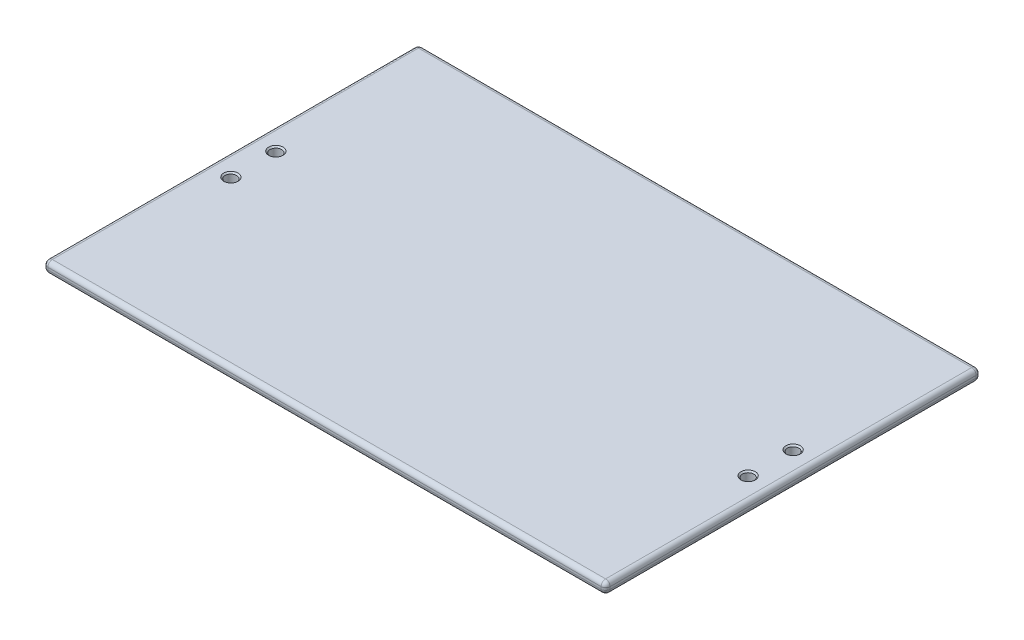
ISO-10303-21;
HEADER;
FILE_DESCRIPTION(('STEP AP214'),'2;1');
FILE_NAME('part.step','',(''),(''),'','','');
FILE_SCHEMA(('AUTOMOTIVE_DESIGN { 1 0 10303 214 1 1 1 1 }'));
ENDSEC;
DATA;
#1=APPLICATION_CONTEXT('core data for automotive mechanical design processes');
#2=APPLICATION_PROTOCOL_DEFINITION('international standard','automotive_design',2000,#1);
#3=PRODUCT_CONTEXT('',#1,'mechanical');
#4=PRODUCT('Part','Part','',(#3));
#5=PRODUCT_RELATED_PRODUCT_CATEGORY('part','',(#4));
#6=PRODUCT_DEFINITION_FORMATION('','',#4);
#7=PRODUCT_DEFINITION_CONTEXT('part definition',#1,'design');
#8=PRODUCT_DEFINITION('design','',#6,#7);
#9=PRODUCT_DEFINITION_SHAPE('','',#8);
#10=(LENGTH_UNIT() NAMED_UNIT(*) SI_UNIT(.MILLI.,.METRE.));
#11=(NAMED_UNIT(*) PLANE_ANGLE_UNIT() SI_UNIT($,.RADIAN.));
#12=(NAMED_UNIT(*) SI_UNIT($,.STERADIAN.) SOLID_ANGLE_UNIT());
#13=UNCERTAINTY_MEASURE_WITH_UNIT(LENGTH_MEASURE(1.E-05),#10,'distance_accuracy_value','');
#14=(GEOMETRIC_REPRESENTATION_CONTEXT(3) GLOBAL_UNCERTAINTY_ASSIGNED_CONTEXT((#13)) GLOBAL_UNIT_ASSIGNED_CONTEXT((#10,
#11,#12)) REPRESENTATION_CONTEXT('',''));
#15=CARTESIAN_POINT('',(0.,0.,0.));
#16=DIRECTION('',(0.,0.,1.));
#17=DIRECTION('',(1.,0.,0.));
#18=AXIS2_PLACEMENT_3D('',#15,#16,#17);
#19=CARTESIAN_POINT('',(-20.,2.,-33.35));
#20=DIRECTION('',(0.,0.,1.));
#21=DIRECTION('',(1.,0.,0.));
#22=AXIS2_PLACEMENT_3D('',#19,#20,#21);
#23=PLANE('',#22);
#24=DIRECTION('',(1.,0.,0.));
#25=VECTOR('',#24,1.);
#26=CARTESIAN_POINT('',(-20.,16.2,-33.35));
#27=LINE('',#26,#25);
#28=CARTESIAN_POINT('',(-119.2,16.2,-33.35));
#29=VERTEX_POINT('',#28);
#30=CARTESIAN_POINT('',(-20.8,16.2,-33.35));
#31=VERTEX_POINT('',#30);
#32=EDGE_CURVE('E243',#29,#31,#27,.T.);
#33=ORIENTED_EDGE('',*,*,#32,.T.);
#34=DIRECTION('',(0.,1.,0.));
#35=VECTOR('',#34,1.);
#36=CARTESIAN_POINT('',(-20.8,2.,-33.35));
#37=LINE('',#36,#35);
#38=CARTESIAN_POINT('',(-20.8,15.8,-33.35));
#39=VERTEX_POINT('',#38);
#40=EDGE_CURVE('E245',#31,#39,#37,.F.);
#41=ORIENTED_EDGE('',*,*,#40,.T.);
#42=DIRECTION('',(1.,0.,0.));
#43=VECTOR('',#42,1.);
#44=CARTESIAN_POINT('',(-20.,15.8,-33.35));
#45=LINE('',#44,#43);
#46=CARTESIAN_POINT('',(-119.2,15.8,-33.35));
#47=VERTEX_POINT('',#46);
#48=EDGE_CURVE('E241',#39,#47,#45,.F.);
#49=ORIENTED_EDGE('',*,*,#48,.T.);
#50=DIRECTION('',(0.,1.,0.));
#51=VECTOR('',#50,1.);
#52=CARTESIAN_POINT('',(-119.2,2.,-33.35));
#53=LINE('',#52,#51);
#54=EDGE_CURVE('E239',#47,#29,#53,.T.);
#55=ORIENTED_EDGE('',*,*,#54,.T.);
#56=EDGE_LOOP('',(#33,#41,#49,#55));
#57=FACE_BOUND('',#56,.T.);
#58=ADVANCED_FACE('F79',(#57),#23,.F.);
#59=CARTESIAN_POINT('',(-20.,2.,33.35));
#60=DIRECTION('',(0.,0.,-1.));
#61=DIRECTION('',(-1.,0.,0.));
#62=AXIS2_PLACEMENT_3D('',#59,#60,#61);
#63=PLANE('',#62);
#64=DIRECTION('',(1.,0.,0.));
#65=VECTOR('',#64,1.);
#66=CARTESIAN_POINT('',(-20.,15.8,33.35));
#67=LINE('',#66,#65);
#68=CARTESIAN_POINT('',(-119.2,15.8,33.35));
#69=VERTEX_POINT('',#68);
#70=CARTESIAN_POINT('',(-20.8,15.8,33.35));
#71=VERTEX_POINT('',#70);
#72=EDGE_CURVE('E179',#69,#71,#67,.T.);
#73=ORIENTED_EDGE('',*,*,#72,.T.);
#74=DIRECTION('',(0.,1.,0.));
#75=VECTOR('',#74,1.);
#76=CARTESIAN_POINT('',(-20.8,2.,33.35));
#77=LINE('',#76,#75);
#78=CARTESIAN_POINT('',(-20.8,16.2,33.35));
#79=VERTEX_POINT('',#78);
#80=EDGE_CURVE('E175',#71,#79,#77,.T.);
#81=ORIENTED_EDGE('',*,*,#80,.T.);
#82=DIRECTION('',(1.,0.,0.));
#83=VECTOR('',#82,1.);
#84=CARTESIAN_POINT('',(-120.,16.2,33.35));
#85=LINE('',#84,#83);
#86=CARTESIAN_POINT('',(-119.2,16.2,33.35));
#87=VERTEX_POINT('',#86);
#88=EDGE_CURVE('E167',#79,#87,#85,.F.);
#89=ORIENTED_EDGE('',*,*,#88,.T.);
#90=DIRECTION('',(0.,1.,0.));
#91=VECTOR('',#90,1.);
#92=CARTESIAN_POINT('',(-119.2,2.,33.35));
#93=LINE('',#92,#91);
#94=EDGE_CURVE('E172',#87,#69,#93,.F.);
#95=ORIENTED_EDGE('',*,*,#94,.T.);
#96=EDGE_LOOP('',(#73,#81,#89,#95));
#97=FACE_BOUND('',#96,.T.);
#98=ADVANCED_FACE('F170',(#97),#63,.F.);
#99=CARTESIAN_POINT('',(-120.,15.,-33.35));
#100=DIRECTION('',(0.,1.,0.));
#101=DIRECTION('',(0.,0.,1.));
#102=AXIS2_PLACEMENT_3D('',#99,#100,#101);
#103=PLANE('',#102);
#104=DIRECTION('',(0.,0.,1.));
#105=VECTOR('',#104,1.);
#106=CARTESIAN_POINT('',(-20.8,15.,-33.35));
#107=LINE('',#106,#105);
#108=CARTESIAN_POINT('',(-20.8,15.,-32.55));
#109=VERTEX_POINT('',#108);
#110=CARTESIAN_POINT('',(-20.8,15.,32.55));
#111=VERTEX_POINT('',#110);
#112=EDGE_CURVE('E218',#109,#111,#107,.T.);
#113=ORIENTED_EDGE('',*,*,#112,.T.);
#114=DIRECTION('',(1.,0.,0.));
#115=VECTOR('',#114,1.);
#116=CARTESIAN_POINT('',(-120.,15.,32.55));
#117=LINE('',#116,#115);
#118=CARTESIAN_POINT('',(-119.2,15.,32.55));
#119=VERTEX_POINT('',#118);
#120=EDGE_CURVE('E220',#111,#119,#117,.F.);
#121=ORIENTED_EDGE('',*,*,#120,.T.);
#122=DIRECTION('',(0.,0.,1.));
#123=VECTOR('',#122,1.);
#124=CARTESIAN_POINT('',(-119.2,15.,-33.35));
#125=LINE('',#124,#123);
#126=CARTESIAN_POINT('',(-119.2,15.,-32.55));
#127=VERTEX_POINT('',#126);
#128=EDGE_CURVE('E214',#119,#127,#125,.F.);
#129=ORIENTED_EDGE('',*,*,#128,.T.);
#130=DIRECTION('',(1.,0.,0.));
#131=VECTOR('',#130,1.);
#132=CARTESIAN_POINT('',(-120.,15.,-32.55));
#133=LINE('',#132,#131);
#134=EDGE_CURVE('E216',#127,#109,#133,.T.);
#135=ORIENTED_EDGE('',*,*,#134,.T.);
#136=EDGE_LOOP('',(#113,#121,#129,#135));
#137=FACE_BOUND('',#136,.T.);
#138=CARTESIAN_POINT('',(-116.,15.,-3.99999999999999));
#139=DIRECTION('',(0.,1.,0.));
#140=DIRECTION('',(0.,0.,1.));
#141=AXIS2_PLACEMENT_3D('',#138,#139,#140);
#142=CIRCLE('',#141,1.025);
#143=CARTESIAN_POINT('',(-116.,15.,-2.97499999999999));
#144=VERTEX_POINT('',#143);
#145=EDGE_CURVE('E315',#144,#144,#142,.T.);
#146=ORIENTED_EDGE('',*,*,#145,.T.);
#147=EDGE_LOOP('',(#146));
#148=FACE_BOUND('',#147,.T.);
#149=CARTESIAN_POINT('',(-116.,15.,4.00000000000001));
#150=DIRECTION('',(0.,1.,0.));
#151=DIRECTION('',(0.,0.,1.));
#152=AXIS2_PLACEMENT_3D('',#149,#150,#151);
#153=CIRCLE('',#152,1.025);
#154=CARTESIAN_POINT('',(-116.,15.,5.02500000000001));
#155=VERTEX_POINT('',#154);
#156=EDGE_CURVE('E326',#155,#155,#153,.T.);
#157=ORIENTED_EDGE('',*,*,#156,.T.);
#158=EDGE_LOOP('',(#157));
#159=FACE_BOUND('',#158,.T.);
#160=CARTESIAN_POINT('',(-24.,15.,-3.99999999999999));
#161=DIRECTION('',(0.,1.,0.));
#162=DIRECTION('',(0.,0.,1.));
#163=AXIS2_PLACEMENT_3D('',#160,#161,#162);
#164=CIRCLE('',#163,1.025);
#165=CARTESIAN_POINT('',(-24.,15.,-2.97499999999999));
#166=VERTEX_POINT('',#165);
#167=EDGE_CURVE('E335',#166,#166,#164,.T.);
#168=ORIENTED_EDGE('',*,*,#167,.T.);
#169=EDGE_LOOP('',(#168));
#170=FACE_BOUND('',#169,.T.);
#171=CARTESIAN_POINT('',(-24.,15.,4.00000000000001));
#172=DIRECTION('',(0.,1.,0.));
#173=DIRECTION('',(0.,0.,1.));
#174=AXIS2_PLACEMENT_3D('',#171,#172,#173);
#175=CIRCLE('',#174,1.025);
#176=CARTESIAN_POINT('',(-24.,15.,5.02500000000001));
#177=VERTEX_POINT('',#176);
#178=EDGE_CURVE('E205',#177,#177,#175,.T.);
#179=ORIENTED_EDGE('',*,*,#178,.T.);
#180=EDGE_LOOP('',(#179));
#181=FACE_BOUND('',#180,.T.);
#182=ADVANCED_FACE('F355',(#137,#148,#159,#170,#181),#103,.F.);
#183=CARTESIAN_POINT('',(-120.,17.,-33.35));
#184=DIRECTION('',(0.,1.,0.));
#185=DIRECTION('',(0.,0.,1.));
#186=AXIS2_PLACEMENT_3D('',#183,#184,#185);
#187=PLANE('',#186);
#188=DIRECTION('',(0.,0.,1.));
#189=VECTOR('',#188,1.);
#190=CARTESIAN_POINT('',(-119.2,17.,33.35));
#191=LINE('',#190,#189);
#192=CARTESIAN_POINT('',(-119.2,17.,-32.55));
#193=VERTEX_POINT('',#192);
#194=CARTESIAN_POINT('',(-119.2,17.,32.55));
#195=VERTEX_POINT('',#194);
#196=EDGE_CURVE('E223',#193,#195,#191,.T.);
#197=ORIENTED_EDGE('',*,*,#196,.T.);
#198=DIRECTION('',(1.,0.,0.));
#199=VECTOR('',#198,1.);
#200=CARTESIAN_POINT('',(-20.,17.,32.55));
#201=LINE('',#200,#199);
#202=CARTESIAN_POINT('',(-20.8,17.,32.55));
#203=VERTEX_POINT('',#202);
#204=EDGE_CURVE('E187',#195,#203,#201,.T.);
#205=ORIENTED_EDGE('',*,*,#204,.T.);
#206=DIRECTION('',(0.,0.,1.));
#207=VECTOR('',#206,1.);
#208=CARTESIAN_POINT('',(-20.8,17.,-33.35));
#209=LINE('',#208,#207);
#210=CARTESIAN_POINT('',(-20.8,17.,-32.55));
#211=VERTEX_POINT('',#210);
#212=EDGE_CURVE('E227',#203,#211,#209,.F.);
#213=ORIENTED_EDGE('',*,*,#212,.T.);
#214=DIRECTION('',(1.,0.,0.));
#215=VECTOR('',#214,1.);
#216=CARTESIAN_POINT('',(-120.,17.,-32.55));
#217=LINE('',#216,#215);
#218=EDGE_CURVE('E225',#211,#193,#217,.F.);
#219=ORIENTED_EDGE('',*,*,#218,.T.);
#220=EDGE_LOOP('',(#197,#205,#213,#219));
#221=FACE_BOUND('',#220,.T.);
#222=CARTESIAN_POINT('',(-116.,17.,-3.99999999999999));
#223=DIRECTION('',(0.,1.,0.));
#224=DIRECTION('',(0.,0.,1.));
#225=AXIS2_PLACEMENT_3D('',#222,#223,#224);
#226=CIRCLE('',#225,1.275);
#227=CARTESIAN_POINT('',(-116.,17.,-2.72499999999999));
#228=VERTEX_POINT('',#227);
#229=EDGE_CURVE('E304',#228,#228,#226,.T.);
#230=ORIENTED_EDGE('',*,*,#229,.F.);
#231=EDGE_LOOP('',(#230));
#232=FACE_BOUND('',#231,.T.);
#233=CARTESIAN_POINT('',(-116.,17.,4.00000000000001));
#234=DIRECTION('',(0.,1.,0.));
#235=DIRECTION('',(0.,0.,1.));
#236=AXIS2_PLACEMENT_3D('',#233,#234,#235);
#237=CIRCLE('',#236,1.275);
#238=CARTESIAN_POINT('',(-116.,17.,5.27500000000001));
#239=VERTEX_POINT('',#238);
#240=EDGE_CURVE('E320',#239,#239,#237,.T.);
#241=ORIENTED_EDGE('',*,*,#240,.F.);
#242=EDGE_LOOP('',(#241));
#243=FACE_BOUND('',#242,.T.);
#244=CARTESIAN_POINT('',(-24.,17.,-3.99999999999999));
#245=DIRECTION('',(0.,1.,0.));
#246=DIRECTION('',(0.,0.,1.));
#247=AXIS2_PLACEMENT_3D('',#244,#245,#246);
#248=CIRCLE('',#247,1.275);
#249=CARTESIAN_POINT('',(-24.,17.,-2.72499999999999));
#250=VERTEX_POINT('',#249);
#251=EDGE_CURVE('E329',#250,#250,#248,.T.);
#252=ORIENTED_EDGE('',*,*,#251,.F.);
#253=EDGE_LOOP('',(#252));
#254=FACE_BOUND('',#253,.T.);
#255=CARTESIAN_POINT('',(-24.,17.,4.00000000000001));
#256=DIRECTION('',(0.,1.,0.));
#257=DIRECTION('',(0.,0.,1.));
#258=AXIS2_PLACEMENT_3D('',#255,#256,#257);
#259=CIRCLE('',#258,1.275);
#260=CARTESIAN_POINT('',(-24.,17.,5.27500000000001));
#261=VERTEX_POINT('',#260);
#262=EDGE_CURVE('E338',#261,#261,#259,.T.);
#263=ORIENTED_EDGE('',*,*,#262,.F.);
#264=EDGE_LOOP('',(#263));
#265=FACE_BOUND('',#264,.T.);
#266=ADVANCED_FACE('F352',(#221,#232,#243,#254,#265),#187,.T.);
#267=CARTESIAN_POINT('',(-20.,0.,-33.35));
#268=DIRECTION('',(-1.,0.,0.));
#269=DIRECTION('',(0.,0.,1.));
#270=AXIS2_PLACEMENT_3D('',#267,#268,#269);
#271=PLANE('',#270);
#272=DIRECTION('',(0.,1.,0.));
#273=VECTOR('',#272,1.);
#274=CARTESIAN_POINT('',(-20.,0.,32.55));
#275=LINE('',#274,#273);
#276=CARTESIAN_POINT('',(-20.,16.2,32.55));
#277=VERTEX_POINT('',#276);
#278=CARTESIAN_POINT('',(-20.,15.8,32.55));
#279=VERTEX_POINT('',#278);
#280=EDGE_CURVE('E234',#277,#279,#275,.F.);
#281=ORIENTED_EDGE('',*,*,#280,.T.);
#282=DIRECTION('',(0.,0.,1.));
#283=VECTOR('',#282,1.);
#284=CARTESIAN_POINT('',(-20.,15.8,-33.35));
#285=LINE('',#284,#283);
#286=CARTESIAN_POINT('',(-20.,15.8,-32.55));
#287=VERTEX_POINT('',#286);
#288=EDGE_CURVE('E236',#279,#287,#285,.F.);
#289=ORIENTED_EDGE('',*,*,#288,.T.);
#290=DIRECTION('',(0.,1.,0.));
#291=VECTOR('',#290,1.);
#292=CARTESIAN_POINT('',(-20.,0.,-32.55));
#293=LINE('',#292,#291);
#294=CARTESIAN_POINT('',(-20.,16.2,-32.55));
#295=VERTEX_POINT('',#294);
#296=EDGE_CURVE('E230',#287,#295,#293,.T.);
#297=ORIENTED_EDGE('',*,*,#296,.T.);
#298=DIRECTION('',(0.,0.,1.));
#299=VECTOR('',#298,1.);
#300=CARTESIAN_POINT('',(-20.,16.2,33.35));
#301=LINE('',#300,#299);
#302=EDGE_CURVE('E232',#295,#277,#301,.T.);
#303=ORIENTED_EDGE('',*,*,#302,.T.);
#304=EDGE_LOOP('',(#281,#289,#297,#303));
#305=FACE_BOUND('',#304,.T.);
#306=ADVANCED_FACE('F354',(#305),#271,.F.);
#307=CARTESIAN_POINT('',(-120.,0.,-33.35));
#308=DIRECTION('',(1.,0.,0.));
#309=DIRECTION('',(0.,0.,-1.));
#310=AXIS2_PLACEMENT_3D('',#307,#308,#309);
#311=PLANE('',#310);
#312=DIRECTION('',(0.,1.,0.));
#313=VECTOR('',#312,1.);
#314=CARTESIAN_POINT('',(-120.,0.,-32.55));
#315=LINE('',#314,#313);
#316=CARTESIAN_POINT('',(-120.,16.2,-32.55));
#317=VERTEX_POINT('',#316);
#318=CARTESIAN_POINT('',(-120.,15.8,-32.55));
#319=VERTEX_POINT('',#318);
#320=EDGE_CURVE('E88',#317,#319,#315,.F.);
#321=ORIENTED_EDGE('',*,*,#320,.T.);
#322=DIRECTION('',(0.,0.,1.));
#323=VECTOR('',#322,1.);
#324=CARTESIAN_POINT('',(-120.,15.8,-33.35));
#325=LINE('',#324,#323);
#326=CARTESIAN_POINT('',(-120.,15.8,32.55));
#327=VERTEX_POINT('',#326);
#328=EDGE_CURVE('E12',#319,#327,#325,.T.);
#329=ORIENTED_EDGE('',*,*,#328,.T.);
#330=DIRECTION('',(0.,1.,0.));
#331=VECTOR('',#330,1.);
#332=CARTESIAN_POINT('',(-120.,0.,32.55));
#333=LINE('',#332,#331);
#334=CARTESIAN_POINT('',(-120.,16.2,32.55));
#335=VERTEX_POINT('',#334);
#336=EDGE_CURVE('E248',#327,#335,#333,.T.);
#337=ORIENTED_EDGE('',*,*,#336,.T.);
#338=DIRECTION('',(0.,0.,1.));
#339=VECTOR('',#338,1.);
#340=CARTESIAN_POINT('',(-120.,16.2,-33.35));
#341=LINE('',#340,#339);
#342=EDGE_CURVE('E99',#335,#317,#341,.F.);
#343=ORIENTED_EDGE('',*,*,#342,.T.);
#344=EDGE_LOOP('',(#321,#329,#337,#343));
#345=FACE_BOUND('',#344,.T.);
#346=ADVANCED_FACE('F362',(#345),#311,.F.);
#347=CARTESIAN_POINT('',(-24.,17.,4.00000000000001));
#348=DIRECTION('',(0.,1.,0.));
#349=DIRECTION('',(0.,0.,1.));
#350=AXIS2_PLACEMENT_3D('',#347,#348,#349);
#351=CYLINDRICAL_SURFACE('',#350,1.025);
#352=ORIENTED_EDGE('',*,*,#178,.F.);
#353=EDGE_LOOP('',(#352));
#354=FACE_BOUND('',#353,.T.);
#355=CARTESIAN_POINT('',(-24.,16.75,4.00000000000001));
#356=DIRECTION('',(0.,1.,0.));
#357=DIRECTION('',(0.,0.,1.));
#358=AXIS2_PLACEMENT_3D('',#355,#356,#357);
#359=CIRCLE('',#358,1.025);
#360=CARTESIAN_POINT('',(-24.,16.75,5.02500000000001));
#361=VERTEX_POINT('',#360);
#362=EDGE_CURVE('E208',#361,#361,#359,.T.);
#363=ORIENTED_EDGE('',*,*,#362,.T.);
#364=EDGE_LOOP('',(#363));
#365=FACE_BOUND('',#364,.T.);
#366=ADVANCED_FACE('F343',(#354,#365),#351,.F.);
#367=CARTESIAN_POINT('',(-24.,17.,4.00000000000001));
#368=DIRECTION('',(0.,1.,0.));
#369=DIRECTION('',(0.,0.,1.));
#370=AXIS2_PLACEMENT_3D('',#367,#368,#369);
#371=CONICAL_SURFACE('',#370,1.275,0.785398163397448);
#372=ORIENTED_EDGE('',*,*,#362,.F.);
#373=EDGE_LOOP('',(#372));
#374=FACE_BOUND('',#373,.T.);
#375=ORIENTED_EDGE('',*,*,#262,.T.);
#376=EDGE_LOOP('',(#375));
#377=FACE_BOUND('',#376,.T.);
#378=ADVANCED_FACE('F345',(#374,#377),#371,.F.);
#379=CARTESIAN_POINT('',(-24.,17.,-3.99999999999999));
#380=DIRECTION('',(0.,1.,0.));
#381=DIRECTION('',(0.,0.,1.));
#382=AXIS2_PLACEMENT_3D('',#379,#380,#381);
#383=CYLINDRICAL_SURFACE('',#382,1.025);
#384=ORIENTED_EDGE('',*,*,#167,.F.);
#385=EDGE_LOOP('',(#384));
#386=FACE_BOUND('',#385,.T.);
#387=CARTESIAN_POINT('',(-24.,16.75,-3.99999999999999));
#388=DIRECTION('',(0.,1.,0.));
#389=DIRECTION('',(0.,0.,1.));
#390=AXIS2_PLACEMENT_3D('',#387,#388,#389);
#391=CIRCLE('',#390,1.025);
#392=CARTESIAN_POINT('',(-24.,16.75,-2.97499999999999));
#393=VERTEX_POINT('',#392);
#394=EDGE_CURVE('E332',#393,#393,#391,.T.);
#395=ORIENTED_EDGE('',*,*,#394,.T.);
#396=EDGE_LOOP('',(#395));
#397=FACE_BOUND('',#396,.T.);
#398=ADVANCED_FACE('F348',(#386,#397),#383,.F.);
#399=CARTESIAN_POINT('',(-24.,17.,-3.99999999999999));
#400=DIRECTION('',(0.,1.,0.));
#401=DIRECTION('',(0.,0.,1.));
#402=AXIS2_PLACEMENT_3D('',#399,#400,#401);
#403=CONICAL_SURFACE('',#402,1.275,0.785398163397448);
#404=ORIENTED_EDGE('',*,*,#394,.F.);
#405=EDGE_LOOP('',(#404));
#406=FACE_BOUND('',#405,.T.);
#407=ORIENTED_EDGE('',*,*,#251,.T.);
#408=EDGE_LOOP('',(#407));
#409=FACE_BOUND('',#408,.T.);
#410=ADVANCED_FACE('F472',(#406,#409),#403,.F.);
#411=CARTESIAN_POINT('',(-116.,17.,4.00000000000001));
#412=DIRECTION('',(0.,1.,0.));
#413=DIRECTION('',(0.,0.,1.));
#414=AXIS2_PLACEMENT_3D('',#411,#412,#413);
#415=CYLINDRICAL_SURFACE('',#414,1.025);
#416=ORIENTED_EDGE('',*,*,#156,.F.);
#417=EDGE_LOOP('',(#416));
#418=FACE_BOUND('',#417,.T.);
#419=CARTESIAN_POINT('',(-116.,16.75,4.00000000000001));
#420=DIRECTION('',(0.,1.,0.));
#421=DIRECTION('',(0.,0.,1.));
#422=AXIS2_PLACEMENT_3D('',#419,#420,#421);
#423=CIRCLE('',#422,1.025);
#424=CARTESIAN_POINT('',(-116.,16.75,5.02500000000001));
#425=VERTEX_POINT('',#424);
#426=EDGE_CURVE('E323',#425,#425,#423,.T.);
#427=ORIENTED_EDGE('',*,*,#426,.T.);
#428=EDGE_LOOP('',(#427));
#429=FACE_BOUND('',#428,.T.);
#430=ADVANCED_FACE('F476',(#418,#429),#415,.F.);
#431=CARTESIAN_POINT('',(-116.,17.,4.00000000000001));
#432=DIRECTION('',(0.,1.,0.));
#433=DIRECTION('',(0.,0.,1.));
#434=AXIS2_PLACEMENT_3D('',#431,#432,#433);
#435=CONICAL_SURFACE('',#434,1.275,0.785398163397448);
#436=ORIENTED_EDGE('',*,*,#426,.F.);
#437=EDGE_LOOP('',(#436));
#438=FACE_BOUND('',#437,.T.);
#439=ORIENTED_EDGE('',*,*,#240,.T.);
#440=EDGE_LOOP('',(#439));
#441=FACE_BOUND('',#440,.T.);
#442=ADVANCED_FACE('F480',(#438,#441),#435,.F.);
#443=CARTESIAN_POINT('',(-116.,17.,-3.99999999999999));
#444=DIRECTION('',(0.,1.,0.));
#445=DIRECTION('',(0.,0.,1.));
#446=AXIS2_PLACEMENT_3D('',#443,#444,#445);
#447=CYLINDRICAL_SURFACE('',#446,1.025);
#448=ORIENTED_EDGE('',*,*,#145,.F.);
#449=EDGE_LOOP('',(#448));
#450=FACE_BOUND('',#449,.T.);
#451=CARTESIAN_POINT('',(-116.,16.75,-3.99999999999999));
#452=DIRECTION('',(0.,1.,0.));
#453=DIRECTION('',(0.,0.,1.));
#454=AXIS2_PLACEMENT_3D('',#451,#452,#453);
#455=CIRCLE('',#454,1.025);
#456=CARTESIAN_POINT('',(-116.,16.75,-2.97499999999999));
#457=VERTEX_POINT('',#456);
#458=EDGE_CURVE('E310',#457,#457,#455,.T.);
#459=ORIENTED_EDGE('',*,*,#458,.T.);
#460=EDGE_LOOP('',(#459));
#461=FACE_BOUND('',#460,.T.);
#462=ADVANCED_FACE('F484',(#450,#461),#447,.F.);
#463=CARTESIAN_POINT('',(-116.,17.,-3.99999999999999));
#464=DIRECTION('',(0.,1.,0.));
#465=DIRECTION('',(0.,0.,1.));
#466=AXIS2_PLACEMENT_3D('',#463,#464,#465);
#467=CONICAL_SURFACE('',#466,1.275,0.785398163397448);
#468=ORIENTED_EDGE('',*,*,#458,.F.);
#469=EDGE_LOOP('',(#468));
#470=FACE_BOUND('',#469,.T.);
#471=ORIENTED_EDGE('',*,*,#229,.T.);
#472=EDGE_LOOP('',(#471));
#473=FACE_BOUND('',#472,.T.);
#474=ADVANCED_FACE('F446',(#470,#473),#467,.F.);
#475=CARTESIAN_POINT('',(-20.,16.2,-32.55));
#476=DIRECTION('',(-1.,0.,0.));
#477=DIRECTION('',(0.,0.,1.));
#478=AXIS2_PLACEMENT_3D('',#475,#476,#477);
#479=CYLINDRICAL_SURFACE('',#478,0.8);
#480=CARTESIAN_POINT('',(-119.2,16.2,-32.55));
#481=DIRECTION('',(-1.,0.,0.));
#482=DIRECTION('',(0.,0.,1.));
#483=AXIS2_PLACEMENT_3D('',#480,#481,#482);
#484=CIRCLE('',#483,0.8);
#485=EDGE_CURVE('E83',#193,#29,#484,.T.);
#486=ORIENTED_EDGE('',*,*,#485,.F.);
#487=ORIENTED_EDGE('',*,*,#218,.F.);
#488=CARTESIAN_POINT('',(-20.8,16.2,-32.55));
#489=DIRECTION('',(1.,0.,0.));
#490=DIRECTION('',(0.,0.,-1.));
#491=AXIS2_PLACEMENT_3D('',#488,#489,#490);
#492=CIRCLE('',#491,0.8);
#493=EDGE_CURVE('E297',#31,#211,#492,.T.);
#494=ORIENTED_EDGE('',*,*,#493,.F.);
#495=ORIENTED_EDGE('',*,*,#32,.F.);
#496=EDGE_LOOP('',(#486,#487,#494,#495));
#497=FACE_BOUND('',#496,.T.);
#498=ADVANCED_FACE('F81',(#497),#479,.T.);
#499=CARTESIAN_POINT('',(-119.2,16.2,-32.55));
#500=DIRECTION('',(0.,0.,-1.));
#501=DIRECTION('',(-1.,0.,0.));
#502=AXIS2_PLACEMENT_3D('',#499,#500,#501);
#503=SPHERICAL_SURFACE('',#502,0.8);
#504=CARTESIAN_POINT('',(-119.2,16.2,-32.55));
#505=DIRECTION('',(0.,0.,-1.));
#506=DIRECTION('',(-1.,0.,0.));
#507=AXIS2_PLACEMENT_3D('',#504,#505,#506);
#508=CIRCLE('',#507,0.8);
#509=EDGE_CURVE('E293',#193,#317,#508,.F.);
#510=ORIENTED_EDGE('',*,*,#509,.F.);
#511=ORIENTED_EDGE('',*,*,#485,.T.);
#512=CARTESIAN_POINT('',(-119.2,16.2,-32.55));
#513=DIRECTION('',(0.,1.,0.));
#514=DIRECTION('',(0.,0.,1.));
#515=AXIS2_PLACEMENT_3D('',#512,#513,#514);
#516=CIRCLE('',#515,0.8);
#517=EDGE_CURVE('E295',#317,#29,#516,.F.);
#518=ORIENTED_EDGE('',*,*,#517,.F.);
#519=EDGE_LOOP('',(#510,#511,#518));
#520=FACE_BOUND('',#519,.T.);
#521=ADVANCED_FACE('F441',(#520),#503,.T.);
#522=CARTESIAN_POINT('',(-20.8,16.2,-32.55));
#523=DIRECTION('',(0.,1.,0.));
#524=DIRECTION('',(0.,0.,1.));
#525=AXIS2_PLACEMENT_3D('',#522,#523,#524);
#526=SPHERICAL_SURFACE('',#525,0.8);
#527=CARTESIAN_POINT('',(-20.8,16.2,-32.55));
#528=DIRECTION('',(0.,1.,0.));
#529=DIRECTION('',(0.,0.,1.));
#530=AXIS2_PLACEMENT_3D('',#527,#528,#529);
#531=CIRCLE('',#530,0.8);
#532=EDGE_CURVE('E287',#31,#295,#531,.F.);
#533=ORIENTED_EDGE('',*,*,#532,.F.);
#534=ORIENTED_EDGE('',*,*,#493,.T.);
#535=CARTESIAN_POINT('',(-20.8,16.2,-32.55));
#536=DIRECTION('',(0.,0.,-1.));
#537=DIRECTION('',(-1.,0.,0.));
#538=AXIS2_PLACEMENT_3D('',#535,#536,#537);
#539=CIRCLE('',#538,0.8);
#540=EDGE_CURVE('E290',#295,#211,#539,.F.);
#541=ORIENTED_EDGE('',*,*,#540,.F.);
#542=EDGE_LOOP('',(#533,#534,#541));
#543=FACE_BOUND('',#542,.T.);
#544=ADVANCED_FACE('F438',(#543),#526,.T.);
#545=CARTESIAN_POINT('',(-119.2,2.,-32.55));
#546=DIRECTION('',(0.,1.,0.));
#547=DIRECTION('',(0.,0.,1.));
#548=AXIS2_PLACEMENT_3D('',#545,#546,#547);
#549=CYLINDRICAL_SURFACE('',#548,0.8);
#550=ORIENTED_EDGE('',*,*,#517,.T.);
#551=ORIENTED_EDGE('',*,*,#54,.F.);
#552=CARTESIAN_POINT('',(-119.2,15.8,-32.55));
#553=DIRECTION('',(0.,-1.,0.));
#554=DIRECTION('',(0.,0.,-1.));
#555=AXIS2_PLACEMENT_3D('',#552,#553,#554);
#556=CIRCLE('',#555,0.8);
#557=EDGE_CURVE('E281',#319,#47,#556,.T.);
#558=ORIENTED_EDGE('',*,*,#557,.F.);
#559=ORIENTED_EDGE('',*,*,#320,.F.);
#560=EDGE_LOOP('',(#550,#551,#558,#559));
#561=FACE_BOUND('',#560,.T.);
#562=ADVANCED_FACE('F434',(#561),#549,.T.);
#563=CARTESIAN_POINT('',(-119.2,16.2,-33.35));
#564=DIRECTION('',(0.,0.,-1.));
#565=DIRECTION('',(-1.,0.,0.));
#566=AXIS2_PLACEMENT_3D('',#563,#564,#565);
#567=CYLINDRICAL_SURFACE('',#566,0.8);
#568=ORIENTED_EDGE('',*,*,#509,.T.);
#569=ORIENTED_EDGE('',*,*,#342,.F.);
#570=CARTESIAN_POINT('',(-119.2,16.2,32.55));
#571=DIRECTION('',(0.,0.,1.));
#572=DIRECTION('',(1.,0.,0.));
#573=AXIS2_PLACEMENT_3D('',#570,#571,#572);
#574=CIRCLE('',#573,0.8);
#575=EDGE_CURVE('E191',#195,#335,#574,.T.);
#576=ORIENTED_EDGE('',*,*,#575,.F.);
#577=ORIENTED_EDGE('',*,*,#196,.F.);
#578=EDGE_LOOP('',(#568,#569,#576,#577));
#579=FACE_BOUND('',#578,.T.);
#580=ADVANCED_FACE('F431',(#579),#567,.T.);
#581=CARTESIAN_POINT('',(-120.,16.2,32.55));
#582=DIRECTION('',(-1.,0.,0.));
#583=DIRECTION('',(0.,0.,1.));
#584=AXIS2_PLACEMENT_3D('',#581,#582,#583);
#585=CYLINDRICAL_SURFACE('',#584,0.8);
#586=CARTESIAN_POINT('',(-20.8,16.2,32.55));
#587=DIRECTION('',(1.,0.,0.));
#588=DIRECTION('',(0.,0.,-1.));
#589=AXIS2_PLACEMENT_3D('',#586,#587,#588);
#590=CIRCLE('',#589,0.8);
#591=EDGE_CURVE('E192',#203,#79,#590,.T.);
#592=ORIENTED_EDGE('',*,*,#591,.F.);
#593=ORIENTED_EDGE('',*,*,#204,.F.);
#594=CARTESIAN_POINT('',(-119.2,16.2,32.55));
#595=DIRECTION('',(-1.,0.,0.));
#596=DIRECTION('',(0.,0.,1.));
#597=AXIS2_PLACEMENT_3D('',#594,#595,#596);
#598=CIRCLE('',#597,0.8);
#599=EDGE_CURVE('E183',#87,#195,#598,.T.);
#600=ORIENTED_EDGE('',*,*,#599,.F.);
#601=ORIENTED_EDGE('',*,*,#88,.F.);
#602=EDGE_LOOP('',(#592,#593,#600,#601));
#603=FACE_BOUND('',#602,.T.);
#604=ADVANCED_FACE('F185',(#603),#585,.T.);
#605=CARTESIAN_POINT('',(-20.8,16.2,-33.35));
#606=DIRECTION('',(0.,0.,-1.));
#607=DIRECTION('',(-1.,0.,0.));
#608=AXIS2_PLACEMENT_3D('',#605,#606,#607);
#609=CYLINDRICAL_SURFACE('',#608,0.8);
#610=ORIENTED_EDGE('',*,*,#540,.T.);
#611=ORIENTED_EDGE('',*,*,#212,.F.);
#612=CARTESIAN_POINT('',(-20.8,16.2,32.55));
#613=DIRECTION('',(0.,0.,1.));
#614=DIRECTION('',(0.,-1.,0.));
#615=AXIS2_PLACEMENT_3D('',#612,#613,#614);
#616=CIRCLE('',#615,0.8);
#617=EDGE_CURVE('E277',#277,#203,#616,.T.);
#618=ORIENTED_EDGE('',*,*,#617,.F.);
#619=ORIENTED_EDGE('',*,*,#302,.F.);
#620=EDGE_LOOP('',(#610,#611,#618,#619));
#621=FACE_BOUND('',#620,.T.);
#622=ADVANCED_FACE('F424',(#621),#609,.T.);
#623=CARTESIAN_POINT('',(-20.8,0.,-32.55));
#624=DIRECTION('',(0.,1.,0.));
#625=DIRECTION('',(0.,0.,1.));
#626=AXIS2_PLACEMENT_3D('',#623,#624,#625);
#627=CYLINDRICAL_SURFACE('',#626,0.8);
#628=ORIENTED_EDGE('',*,*,#532,.T.);
#629=ORIENTED_EDGE('',*,*,#296,.F.);
#630=CARTESIAN_POINT('',(-20.8,15.8,-32.55));
#631=DIRECTION('',(0.,-1.,0.));
#632=DIRECTION('',(0.,0.,-1.));
#633=AXIS2_PLACEMENT_3D('',#630,#631,#632);
#634=CIRCLE('',#633,0.8);
#635=EDGE_CURVE('E274',#39,#287,#634,.T.);
#636=ORIENTED_EDGE('',*,*,#635,.F.);
#637=ORIENTED_EDGE('',*,*,#40,.F.);
#638=EDGE_LOOP('',(#628,#629,#636,#637));
#639=FACE_BOUND('',#638,.T.);
#640=ADVANCED_FACE('F420',(#639),#627,.T.);
#641=CARTESIAN_POINT('',(-120.,15.8,-32.55));
#642=DIRECTION('',(1.,0.,0.));
#643=DIRECTION('',(0.,0.,-1.));
#644=AXIS2_PLACEMENT_3D('',#641,#642,#643);
#645=CYLINDRICAL_SURFACE('',#644,0.8);
#646=CARTESIAN_POINT('',(-119.2,15.8,-32.55));
#647=DIRECTION('',(-1.,0.,0.));
#648=DIRECTION('',(0.,0.,1.));
#649=AXIS2_PLACEMENT_3D('',#646,#647,#648);
#650=CIRCLE('',#649,0.8);
#651=EDGE_CURVE('E284',#47,#127,#650,.T.);
#652=ORIENTED_EDGE('',*,*,#651,.F.);
#653=ORIENTED_EDGE('',*,*,#48,.F.);
#654=CARTESIAN_POINT('',(-20.8,15.8,-32.55));
#655=DIRECTION('',(1.,0.,0.));
#656=DIRECTION('',(0.,0.,-1.));
#657=AXIS2_PLACEMENT_3D('',#654,#655,#656);
#658=CIRCLE('',#657,0.8);
#659=EDGE_CURVE('E272',#109,#39,#658,.T.);
#660=ORIENTED_EDGE('',*,*,#659,.F.);
#661=ORIENTED_EDGE('',*,*,#134,.F.);
#662=EDGE_LOOP('',(#652,#653,#660,#661));
#663=FACE_BOUND('',#662,.T.);
#664=ADVANCED_FACE('F416',(#663),#645,.T.);
#665=CARTESIAN_POINT('',(-119.2,15.8,-32.55));
#666=DIRECTION('',(0.,0.,-1.));
#667=DIRECTION('',(-1.,0.,0.));
#668=AXIS2_PLACEMENT_3D('',#665,#666,#667);
#669=SPHERICAL_SURFACE('',#668,0.8);
#670=ORIENTED_EDGE('',*,*,#557,.T.);
#671=ORIENTED_EDGE('',*,*,#651,.T.);
#672=CARTESIAN_POINT('',(-119.2,15.8,-32.55));
#673=DIRECTION('',(0.,0.,-1.));
#674=DIRECTION('',(-1.,0.,0.));
#675=AXIS2_PLACEMENT_3D('',#672,#673,#674);
#676=CIRCLE('',#675,0.8);
#677=EDGE_CURVE('E199',#319,#127,#676,.F.);
#678=ORIENTED_EDGE('',*,*,#677,.F.);
#679=EDGE_LOOP('',(#670,#671,#678));
#680=FACE_BOUND('',#679,.T.);
#681=ADVANCED_FACE('F413',(#680),#669,.T.);
#682=CARTESIAN_POINT('',(-119.2,16.2,32.55));
#683=DIRECTION('',(0.,1.,0.));
#684=DIRECTION('',(0.,0.,1.));
#685=AXIS2_PLACEMENT_3D('',#682,#683,#684);
#686=SPHERICAL_SURFACE('',#685,0.8);
#687=ORIENTED_EDGE('',*,*,#599,.T.);
#688=ORIENTED_EDGE('',*,*,#575,.T.);
#689=CARTESIAN_POINT('',(-119.2,16.2,32.55));
#690=DIRECTION('',(0.,1.,0.));
#691=DIRECTION('',(0.,0.,1.));
#692=AXIS2_PLACEMENT_3D('',#689,#690,#691);
#693=CIRCLE('',#692,0.8);
#694=EDGE_CURVE('E195',#87,#335,#693,.F.);
#695=ORIENTED_EDGE('',*,*,#694,.F.);
#696=EDGE_LOOP('',(#687,#688,#695));
#697=FACE_BOUND('',#696,.T.);
#698=ADVANCED_FACE('F196',(#697),#686,.T.);
#699=CARTESIAN_POINT('',(-20.8,16.2,32.55));
#700=DIRECTION('',(0.,1.,0.));
#701=DIRECTION('',(0.,0.,1.));
#702=AXIS2_PLACEMENT_3D('',#699,#700,#701);
#703=SPHERICAL_SURFACE('',#702,0.8);
#704=ORIENTED_EDGE('',*,*,#617,.T.);
#705=ORIENTED_EDGE('',*,*,#591,.T.);
#706=CARTESIAN_POINT('',(-20.8,16.2,32.55));
#707=DIRECTION('',(0.,1.,0.));
#708=DIRECTION('',(0.,0.,1.));
#709=AXIS2_PLACEMENT_3D('',#706,#707,#708);
#710=CIRCLE('',#709,0.8);
#711=EDGE_CURVE('E200',#277,#79,#710,.F.);
#712=ORIENTED_EDGE('',*,*,#711,.F.);
#713=EDGE_LOOP('',(#704,#705,#712));
#714=FACE_BOUND('',#713,.T.);
#715=ADVANCED_FACE('F406',(#714),#703,.T.);
#716=CARTESIAN_POINT('',(-20.8,15.8,-32.55));
#717=DIRECTION('',(0.,0.,-1.));
#718=DIRECTION('',(-1.,0.,0.));
#719=AXIS2_PLACEMENT_3D('',#716,#717,#718);
#720=SPHERICAL_SURFACE('',#719,0.8);
#721=ORIENTED_EDGE('',*,*,#659,.T.);
#722=ORIENTED_EDGE('',*,*,#635,.T.);
#723=CARTESIAN_POINT('',(-20.8,15.8,-32.55));
#724=DIRECTION('',(0.,0.,-1.));
#725=DIRECTION('',(-1.,0.,0.));
#726=AXIS2_PLACEMENT_3D('',#723,#724,#725);
#727=CIRCLE('',#726,0.8);
#728=EDGE_CURVE('E266',#109,#287,#727,.F.);
#729=ORIENTED_EDGE('',*,*,#728,.F.);
#730=EDGE_LOOP('',(#721,#722,#729));
#731=FACE_BOUND('',#730,.T.);
#732=ADVANCED_FACE('F402',(#731),#720,.T.);
#733=CARTESIAN_POINT('',(-119.2,15.8,-33.35));
#734=DIRECTION('',(0.,0.,1.));
#735=DIRECTION('',(1.,0.,0.));
#736=AXIS2_PLACEMENT_3D('',#733,#734,#735);
#737=CYLINDRICAL_SURFACE('',#736,0.8);
#738=ORIENTED_EDGE('',*,*,#677,.T.);
#739=ORIENTED_EDGE('',*,*,#128,.F.);
#740=CARTESIAN_POINT('',(-119.2,15.8,32.55));
#741=DIRECTION('',(0.,0.,1.));
#742=DIRECTION('',(0.,-1.,0.));
#743=AXIS2_PLACEMENT_3D('',#740,#741,#742);
#744=CIRCLE('',#743,0.8);
#745=EDGE_CURVE('E263',#327,#119,#744,.T.);
#746=ORIENTED_EDGE('',*,*,#745,.F.);
#747=ORIENTED_EDGE('',*,*,#328,.F.);
#748=EDGE_LOOP('',(#738,#739,#746,#747));
#749=FACE_BOUND('',#748,.T.);
#750=ADVANCED_FACE('F399',(#749),#737,.T.);
#751=CARTESIAN_POINT('',(-119.2,0.,32.55));
#752=DIRECTION('',(0.,1.,0.));
#753=DIRECTION('',(0.,0.,1.));
#754=AXIS2_PLACEMENT_3D('',#751,#752,#753);
#755=CYLINDRICAL_SURFACE('',#754,0.8);
#756=ORIENTED_EDGE('',*,*,#694,.T.);
#757=ORIENTED_EDGE('',*,*,#336,.F.);
#758=CARTESIAN_POINT('',(-119.2,15.8,32.55));
#759=DIRECTION('',(0.,-1.,0.));
#760=DIRECTION('',(0.,0.,-1.));
#761=AXIS2_PLACEMENT_3D('',#758,#759,#760);
#762=CIRCLE('',#761,0.8);
#763=EDGE_CURVE('E203',#69,#327,#762,.T.);
#764=ORIENTED_EDGE('',*,*,#763,.F.);
#765=ORIENTED_EDGE('',*,*,#94,.F.);
#766=EDGE_LOOP('',(#756,#757,#764,#765));
#767=FACE_BOUND('',#766,.T.);
#768=ADVANCED_FACE('F202',(#767),#755,.T.);
#769=CARTESIAN_POINT('',(-20.8,2.,32.55));
#770=DIRECTION('',(0.,1.,0.));
#771=DIRECTION('',(0.,0.,1.));
#772=AXIS2_PLACEMENT_3D('',#769,#770,#771);
#773=CYLINDRICAL_SURFACE('',#772,0.8);
#774=ORIENTED_EDGE('',*,*,#711,.T.);
#775=ORIENTED_EDGE('',*,*,#80,.F.);
#776=CARTESIAN_POINT('',(-20.8,15.8,32.55));
#777=DIRECTION('',(0.,-1.,0.));
#778=DIRECTION('',(0.,0.,-1.));
#779=AXIS2_PLACEMENT_3D('',#776,#777,#778);
#780=CIRCLE('',#779,0.8);
#781=EDGE_CURVE('E259',#279,#71,#780,.T.);
#782=ORIENTED_EDGE('',*,*,#781,.F.);
#783=ORIENTED_EDGE('',*,*,#280,.F.);
#784=EDGE_LOOP('',(#774,#775,#782,#783));
#785=FACE_BOUND('',#784,.T.);
#786=ADVANCED_FACE('F392',(#785),#773,.T.);
#787=CARTESIAN_POINT('',(-20.8,15.8,-33.35));
#788=DIRECTION('',(0.,0.,1.));
#789=DIRECTION('',(1.,0.,0.));
#790=AXIS2_PLACEMENT_3D('',#787,#788,#789);
#791=CYLINDRICAL_SURFACE('',#790,0.8);
#792=ORIENTED_EDGE('',*,*,#728,.T.);
#793=ORIENTED_EDGE('',*,*,#288,.F.);
#794=CARTESIAN_POINT('',(-20.8,15.8,32.55));
#795=DIRECTION('',(0.,0.,1.));
#796=DIRECTION('',(1.,0.,0.));
#797=AXIS2_PLACEMENT_3D('',#794,#795,#796);
#798=CIRCLE('',#797,0.8);
#799=EDGE_CURVE('E256',#111,#279,#798,.T.);
#800=ORIENTED_EDGE('',*,*,#799,.F.);
#801=ORIENTED_EDGE('',*,*,#112,.F.);
#802=EDGE_LOOP('',(#792,#793,#800,#801));
#803=FACE_BOUND('',#802,.T.);
#804=ADVANCED_FACE('F388',(#803),#791,.T.);
#805=CARTESIAN_POINT('',(-119.2,15.8,32.55));
#806=DIRECTION('',(-1.,0.,0.));
#807=DIRECTION('',(0.,0.,1.));
#808=AXIS2_PLACEMENT_3D('',#805,#806,#807);
#809=SPHERICAL_SURFACE('',#808,0.8);
#810=ORIENTED_EDGE('',*,*,#763,.T.);
#811=ORIENTED_EDGE('',*,*,#745,.T.);
#812=CARTESIAN_POINT('',(-119.2,15.8,32.55));
#813=DIRECTION('',(-1.,0.,0.));
#814=DIRECTION('',(0.,0.,1.));
#815=AXIS2_PLACEMENT_3D('',#812,#813,#814);
#816=CIRCLE('',#815,0.8);
#817=EDGE_CURVE('E254',#69,#119,#816,.F.);
#818=ORIENTED_EDGE('',*,*,#817,.F.);
#819=EDGE_LOOP('',(#810,#811,#818));
#820=FACE_BOUND('',#819,.T.);
#821=ADVANCED_FACE('F384',(#820),#809,.T.);
#822=CARTESIAN_POINT('',(-20.8,15.8,32.55));
#823=DIRECTION('',(1.,0.,0.));
#824=DIRECTION('',(0.,0.,-1.));
#825=AXIS2_PLACEMENT_3D('',#822,#823,#824);
#826=SPHERICAL_SURFACE('',#825,0.8);
#827=ORIENTED_EDGE('',*,*,#799,.T.);
#828=ORIENTED_EDGE('',*,*,#781,.T.);
#829=CARTESIAN_POINT('',(-20.8,15.8,32.55));
#830=DIRECTION('',(1.,0.,0.));
#831=DIRECTION('',(0.,0.,-1.));
#832=AXIS2_PLACEMENT_3D('',#829,#830,#831);
#833=CIRCLE('',#832,0.8);
#834=EDGE_CURVE('E252',#111,#71,#833,.F.);
#835=ORIENTED_EDGE('',*,*,#834,.F.);
#836=EDGE_LOOP('',(#827,#828,#835));
#837=FACE_BOUND('',#836,.T.);
#838=ADVANCED_FACE('F380',(#837),#826,.T.);
#839=CARTESIAN_POINT('',(-20.,15.8,32.55));
#840=DIRECTION('',(1.,0.,0.));
#841=DIRECTION('',(0.,0.,-1.));
#842=AXIS2_PLACEMENT_3D('',#839,#840,#841);
#843=CYLINDRICAL_SURFACE('',#842,0.8);
#844=ORIENTED_EDGE('',*,*,#817,.T.);
#845=ORIENTED_EDGE('',*,*,#120,.F.);
#846=ORIENTED_EDGE('',*,*,#834,.T.);
#847=ORIENTED_EDGE('',*,*,#72,.F.);
#848=EDGE_LOOP('',(#844,#845,#846,#847));
#849=FACE_BOUND('',#848,.T.);
#850=ADVANCED_FACE('F377',(#849),#843,.T.);
#851=CLOSED_SHELL('',(#58,#98,#182,#266,#306,#346,#366,#378,#398,#410,#430,#442,#462,#474,#498,
#521,#544,#562,#580,#604,#622,#640,#664,#681,#698,#715,#732,#750,#768,#786,#804,#821,#838,#850));
#852=MANIFOLD_SOLID_BREP('B2',#851);
#853=ADVANCED_BREP_SHAPE_REPRESENTATION('',(#18,#852),#14);
#854=SHAPE_DEFINITION_REPRESENTATION(#9,#853);
ENDSEC;
END-ISO-10303-21;
